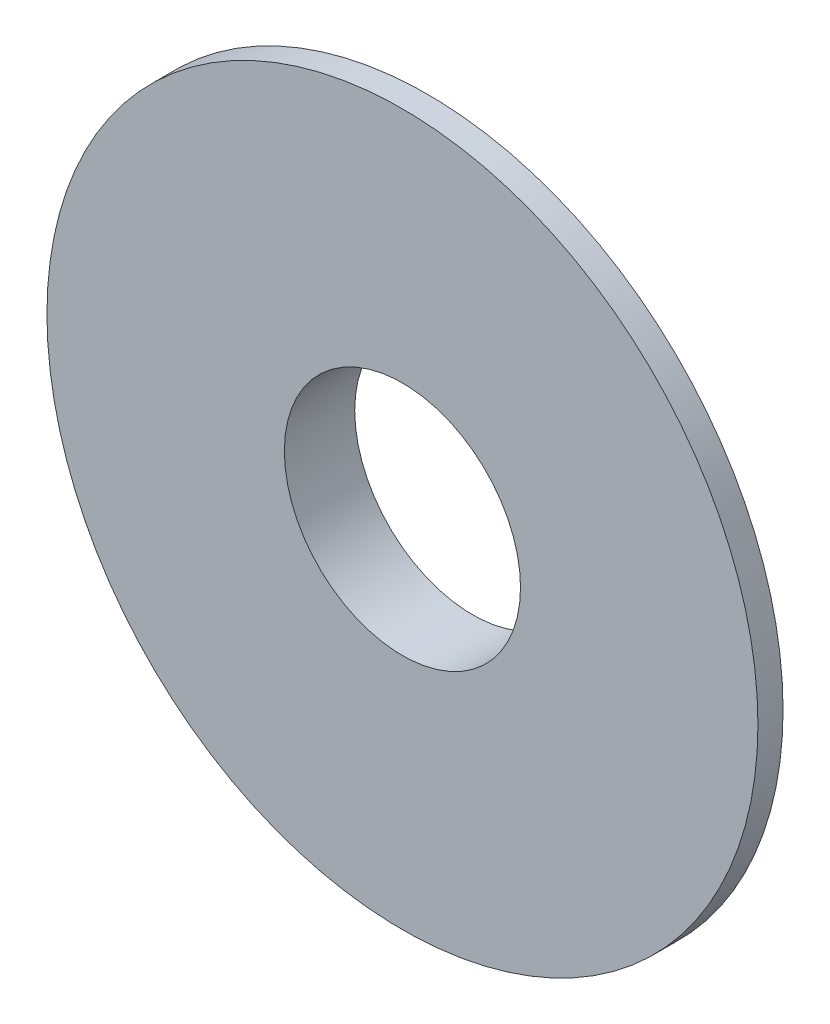
ISO-10303-21;
HEADER;
FILE_DESCRIPTION(('STEP AP214'),'2;1');
FILE_NAME('part.step','',(''),(''),'','','');
FILE_SCHEMA(('AUTOMOTIVE_DESIGN { 1 0 10303 214 1 1 1 1 }'));
ENDSEC;
DATA;
#1=APPLICATION_CONTEXT('core data for automotive mechanical design processes');
#2=APPLICATION_PROTOCOL_DEFINITION('international standard','automotive_design',2000,#1);
#3=PRODUCT_CONTEXT('',#1,'mechanical');
#4=PRODUCT('Part','Part','',(#3));
#5=PRODUCT_RELATED_PRODUCT_CATEGORY('part','',(#4));
#6=PRODUCT_DEFINITION_FORMATION('','',#4);
#7=PRODUCT_DEFINITION_CONTEXT('part definition',#1,'design');
#8=PRODUCT_DEFINITION('design','',#6,#7);
#9=PRODUCT_DEFINITION_SHAPE('','',#8);
#10=(LENGTH_UNIT() NAMED_UNIT(*) SI_UNIT(.MILLI.,.METRE.));
#11=(NAMED_UNIT(*) PLANE_ANGLE_UNIT() SI_UNIT($,.RADIAN.));
#12=(NAMED_UNIT(*) SI_UNIT($,.STERADIAN.) SOLID_ANGLE_UNIT());
#13=UNCERTAINTY_MEASURE_WITH_UNIT(LENGTH_MEASURE(1.E-05),#10,'distance_accuracy_value','');
#14=(GEOMETRIC_REPRESENTATION_CONTEXT(3) GLOBAL_UNCERTAINTY_ASSIGNED_CONTEXT((#13)) GLOBAL_UNIT_ASSIGNED_CONTEXT((#10,
#11,#12)) REPRESENTATION_CONTEXT('',''));
#15=CARTESIAN_POINT('',(0.,0.,0.));
#16=DIRECTION('',(0.,0.,1.));
#17=DIRECTION('',(1.,0.,0.));
#18=AXIS2_PLACEMENT_3D('',#15,#16,#17);
#19=CARTESIAN_POINT('',(0.,0.,35.));
#20=DIRECTION('',(0.,0.,1.));
#21=DIRECTION('',(1.,0.,0.));
#22=AXIS2_PLACEMENT_3D('',#19,#20,#21);
#23=PLANE('',#22);
#24=CARTESIAN_POINT('',(0.,0.,35.));
#25=DIRECTION('',(0.,0.,1.));
#26=DIRECTION('',(1.,0.,0.));
#27=AXIS2_PLACEMENT_3D('',#24,#25,#26);
#28=CIRCLE('',#27,70.7538461538462);
#29=CARTESIAN_POINT('',(70.7538461538462,0.,35.));
#30=VERTEX_POINT('',#29);
#31=EDGE_CURVE('E46',#30,#30,#28,.T.);
#32=ORIENTED_EDGE('',*,*,#31,.F.);
#33=EDGE_LOOP('',(#32));
#34=FACE_BOUND('',#33,.T.);
#35=CARTESIAN_POINT('',(0.,0.,35.));
#36=DIRECTION('',(0.,0.,1.));
#37=DIRECTION('',(1.,0.,0.));
#38=AXIS2_PLACEMENT_3D('',#35,#36,#37);
#39=CIRCLE('',#38,27.5);
#40=CARTESIAN_POINT('',(27.5,0.,35.));
#41=VERTEX_POINT('',#40);
#42=EDGE_CURVE('E10',#41,#41,#39,.F.);
#43=ORIENTED_EDGE('',*,*,#42,.F.);
#44=EDGE_LOOP('',(#43));
#45=FACE_BOUND('',#44,.T.);
#46=ADVANCED_FACE('F35',(#34,#45),#23,.F.);
#47=CARTESIAN_POINT('',(0.,0.,40.));
#48=DIRECTION('',(0.,0.,1.));
#49=DIRECTION('',(1.,0.,0.));
#50=AXIS2_PLACEMENT_3D('',#47,#48,#49);
#51=PLANE('',#50);
#52=CARTESIAN_POINT('',(0.,0.,40.));
#53=DIRECTION('',(0.,0.,1.));
#54=DIRECTION('',(1.,0.,0.));
#55=AXIS2_PLACEMENT_3D('',#52,#53,#54);
#56=CIRCLE('',#55,23.5);
#57=CARTESIAN_POINT('',(23.5,0.,40.));
#58=VERTEX_POINT('',#57);
#59=EDGE_CURVE('E51',#58,#58,#56,.T.);
#60=ORIENTED_EDGE('',*,*,#59,.F.);
#61=EDGE_LOOP('',(#60));
#62=FACE_BOUND('',#61,.T.);
#63=CARTESIAN_POINT('',(0.,0.,40.));
#64=DIRECTION('',(0.,0.,1.));
#65=DIRECTION('',(1.,0.,0.));
#66=AXIS2_PLACEMENT_3D('',#63,#64,#65);
#67=CIRCLE('',#66,70.7538461538462);
#68=CARTESIAN_POINT('',(70.7538461538462,0.,40.));
#69=VERTEX_POINT('',#68);
#70=EDGE_CURVE('E42',#69,#69,#67,.T.);
#71=ORIENTED_EDGE('',*,*,#70,.T.);
#72=EDGE_LOOP('',(#71));
#73=FACE_BOUND('',#72,.T.);
#74=ADVANCED_FACE('F75',(#62,#73),#51,.T.);
#75=CARTESIAN_POINT('',(0.,0.,40.));
#76=DIRECTION('',(0.,0.,-1.));
#77=DIRECTION('',(-1.,0.,0.));
#78=AXIS2_PLACEMENT_3D('',#75,#76,#77);
#79=CYLINDRICAL_SURFACE('',#78,70.7538461538462);
#80=ORIENTED_EDGE('',*,*,#70,.F.);
#81=EDGE_LOOP('',(#80));
#82=FACE_BOUND('',#81,.T.);
#83=ORIENTED_EDGE('',*,*,#31,.T.);
#84=EDGE_LOOP('',(#83));
#85=FACE_BOUND('',#84,.T.);
#86=ADVANCED_FACE('F37',(#82,#85),#79,.T.);
#87=CARTESIAN_POINT('',(0.,0.,40.));
#88=DIRECTION('',(0.,0.,-1.));
#89=DIRECTION('',(-1.,0.,0.));
#90=AXIS2_PLACEMENT_3D('',#87,#88,#89);
#91=CYLINDRICAL_SURFACE('',#90,23.5);
#92=ORIENTED_EDGE('',*,*,#59,.T.);
#93=EDGE_LOOP('',(#92));
#94=FACE_BOUND('',#93,.T.);
#95=CARTESIAN_POINT('',(0.,0.,26.));
#96=DIRECTION('',(0.,0.,1.));
#97=DIRECTION('',(1.,0.,0.));
#98=AXIS2_PLACEMENT_3D('',#95,#96,#97);
#99=CIRCLE('',#98,23.5);
#100=CARTESIAN_POINT('',(23.5,0.,26.));
#101=VERTEX_POINT('',#100);
#102=EDGE_CURVE('E58',#101,#101,#99,.T.);
#103=ORIENTED_EDGE('',*,*,#102,.F.);
#104=EDGE_LOOP('',(#103));
#105=FACE_BOUND('',#104,.T.);
#106=ADVANCED_FACE('F64',(#94,#105),#91,.F.);
#107=CARTESIAN_POINT('',(0.,0.,40.));
#108=DIRECTION('',(0.,0.,-1.));
#109=DIRECTION('',(-1.,0.,0.));
#110=AXIS2_PLACEMENT_3D('',#107,#108,#109);
#111=CYLINDRICAL_SURFACE('',#110,27.5);
#112=CARTESIAN_POINT('',(0.,0.,26.));
#113=DIRECTION('',(0.,0.,1.));
#114=DIRECTION('',(1.,0.,0.));
#115=AXIS2_PLACEMENT_3D('',#112,#113,#114);
#116=CIRCLE('',#115,27.5);
#117=CARTESIAN_POINT('',(27.5,0.,26.));
#118=VERTEX_POINT('',#117);
#119=EDGE_CURVE('E55',#118,#118,#116,.T.);
#120=ORIENTED_EDGE('',*,*,#119,.T.);
#121=EDGE_LOOP('',(#120));
#122=FACE_BOUND('',#121,.T.);
#123=ORIENTED_EDGE('',*,*,#42,.T.);
#124=EDGE_LOOP('',(#123));
#125=FACE_BOUND('',#124,.T.);
#126=ADVANCED_FACE('F66',(#122,#125),#111,.T.);
#127=CARTESIAN_POINT('',(0.,0.,26.));
#128=DIRECTION('',(0.,0.,1.));
#129=DIRECTION('',(1.,0.,0.));
#130=AXIS2_PLACEMENT_3D('',#127,#128,#129);
#131=PLANE('',#130);
#132=ORIENTED_EDGE('',*,*,#119,.F.);
#133=EDGE_LOOP('',(#132));
#134=FACE_BOUND('',#133,.T.);
#135=ORIENTED_EDGE('',*,*,#102,.T.);
#136=EDGE_LOOP('',(#135));
#137=FACE_BOUND('',#136,.T.);
#138=ADVANCED_FACE('F62',(#134,#137),#131,.F.);
#139=CLOSED_SHELL('',(#46,#74,#86,#106,#126,#138));
#140=MANIFOLD_SOLID_BREP('B2',#139);
#141=ADVANCED_BREP_SHAPE_REPRESENTATION('',(#18,#140),#14);
#142=SHAPE_DEFINITION_REPRESENTATION(#9,#141);
ENDSEC;
END-ISO-10303-21;
